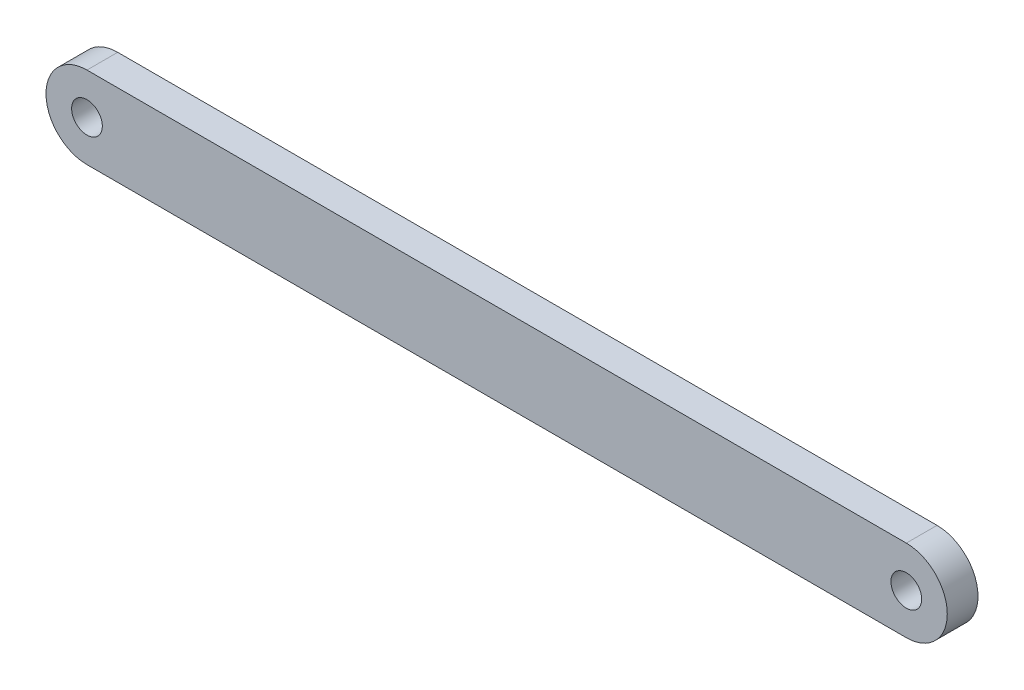
ISO-10303-21;
HEADER;
FILE_DESCRIPTION(('STEP AP214'),'2;1');
FILE_NAME('part.step','',(''),(''),'','','');
FILE_SCHEMA(('AUTOMOTIVE_DESIGN { 1 0 10303 214 1 1 1 1 }'));
ENDSEC;
DATA;
#1=APPLICATION_CONTEXT('core data for automotive mechanical design processes');
#2=APPLICATION_PROTOCOL_DEFINITION('international standard','automotive_design',2000,#1);
#3=PRODUCT_CONTEXT('',#1,'mechanical');
#4=PRODUCT('Part','Part','',(#3));
#5=PRODUCT_RELATED_PRODUCT_CATEGORY('part','',(#4));
#6=PRODUCT_DEFINITION_FORMATION('','',#4);
#7=PRODUCT_DEFINITION_CONTEXT('part definition',#1,'design');
#8=PRODUCT_DEFINITION('design','',#6,#7);
#9=PRODUCT_DEFINITION_SHAPE('','',#8);
#10=(LENGTH_UNIT() NAMED_UNIT(*) SI_UNIT(.MILLI.,.METRE.));
#11=(NAMED_UNIT(*) PLANE_ANGLE_UNIT() SI_UNIT($,.RADIAN.));
#12=(NAMED_UNIT(*) SI_UNIT($,.STERADIAN.) SOLID_ANGLE_UNIT());
#13=UNCERTAINTY_MEASURE_WITH_UNIT(LENGTH_MEASURE(1.E-05),#10,'distance_accuracy_value','');
#14=(GEOMETRIC_REPRESENTATION_CONTEXT(3) GLOBAL_UNCERTAINTY_ASSIGNED_CONTEXT((#13)) GLOBAL_UNIT_ASSIGNED_CONTEXT((#10,
#11,#12)) REPRESENTATION_CONTEXT('',''));
#15=CARTESIAN_POINT('',(0.,0.,0.));
#16=DIRECTION('',(0.,0.,1.));
#17=DIRECTION('',(1.,0.,0.));
#18=AXIS2_PLACEMENT_3D('',#15,#16,#17);
#19=CARTESIAN_POINT('',(-65.045038185394,-11.5842044872883,3.));
#20=DIRECTION('',(0.,0.,1.));
#21=DIRECTION('',(1.,0.,0.));
#22=AXIS2_PLACEMENT_3D('',#19,#20,#21);
#23=PLANE('',#22);
#24=CARTESIAN_POINT('',(-65.045038185394,-11.5842044872883,3.));
#25=DIRECTION('',(0.,0.,1.));
#26=DIRECTION('',(1.,0.,0.));
#27=AXIS2_PLACEMENT_3D('',#24,#25,#26);
#28=CIRCLE('',#27,1.5);
#29=CARTESIAN_POINT('',(-63.545038185394,-11.5842044872883,3.));
#30=VERTEX_POINT('',#29);
#31=EDGE_CURVE('E101',#30,#30,#28,.T.);
#32=ORIENTED_EDGE('',*,*,#31,.F.);
#33=EDGE_LOOP('',(#32));
#34=FACE_BOUND('',#33,.T.);
#35=CARTESIAN_POINT('',(-65.045038185394,-11.5842044872883,3.));
#36=DIRECTION('',(0.,0.,1.));
#37=DIRECTION('',(1.,0.,0.));
#38=AXIS2_PLACEMENT_3D('',#35,#36,#37);
#39=CIRCLE('',#38,4.);
#40=CARTESIAN_POINT('',(-65.045038185394,-7.58420448728826,3.));
#41=VERTEX_POINT('',#40);
#42=CARTESIAN_POINT('',(-65.045038185394,-15.5842044872883,3.));
#43=VERTEX_POINT('',#42);
#44=EDGE_CURVE('E86',#41,#43,#39,.T.);
#45=ORIENTED_EDGE('',*,*,#44,.T.);
#46=DIRECTION('',(1.,0.,0.));
#47=VECTOR('',#46,1.);
#48=CARTESIAN_POINT('',(-65.045038185394,-15.5842044872883,3.));
#49=LINE('',#48,#47);
#50=CARTESIAN_POINT('',(14.954961814606,-15.5842044872883,3.));
#51=VERTEX_POINT('',#50);
#52=EDGE_CURVE('E81',#43,#51,#49,.T.);
#53=ORIENTED_EDGE('',*,*,#52,.T.);
#54=CARTESIAN_POINT('',(14.954961814606,-11.5842044872883,3.));
#55=DIRECTION('',(0.,0.,1.));
#56=DIRECTION('',(1.,0.,0.));
#57=AXIS2_PLACEMENT_3D('',#54,#55,#56);
#58=CIRCLE('',#57,4.);
#59=CARTESIAN_POINT('',(14.954961814606,-7.58420448728826,3.));
#60=VERTEX_POINT('',#59);
#61=EDGE_CURVE('E84',#51,#60,#58,.T.);
#62=ORIENTED_EDGE('',*,*,#61,.T.);
#63=DIRECTION('',(-1.,0.,0.));
#64=VECTOR('',#63,1.);
#65=CARTESIAN_POINT('',(-65.045038185394,-7.58420448728826,3.));
#66=LINE('',#65,#64);
#67=EDGE_CURVE('E51',#60,#41,#66,.T.);
#68=ORIENTED_EDGE('',*,*,#67,.T.);
#69=EDGE_LOOP('',(#45,#53,#62,#68));
#70=FACE_BOUND('',#69,.T.);
#71=CARTESIAN_POINT('',(14.954961814606,-11.5842044872883,3.));
#72=DIRECTION('',(0.,0.,1.));
#73=DIRECTION('',(1.,0.,0.));
#74=AXIS2_PLACEMENT_3D('',#71,#72,#73);
#75=CIRCLE('',#74,1.5);
#76=CARTESIAN_POINT('',(16.454961814606,-11.5842044872883,3.));
#77=VERTEX_POINT('',#76);
#78=EDGE_CURVE('E116',#77,#77,#75,.T.);
#79=ORIENTED_EDGE('',*,*,#78,.F.);
#80=EDGE_LOOP('',(#79));
#81=FACE_BOUND('',#80,.T.);
#82=ADVANCED_FACE('F34',(#34,#70,#81),#23,.T.);
#83=CARTESIAN_POINT('',(-65.045038185394,-11.5842044872883,0.));
#84=DIRECTION('',(0.,0.,1.));
#85=DIRECTION('',(1.,0.,0.));
#86=AXIS2_PLACEMENT_3D('',#83,#84,#85);
#87=PLANE('',#86);
#88=CARTESIAN_POINT('',(-65.045038185394,-11.5842044872883,0.));
#89=DIRECTION('',(0.,0.,1.));
#90=DIRECTION('',(1.,0.,0.));
#91=AXIS2_PLACEMENT_3D('',#88,#89,#90);
#92=CIRCLE('',#91,1.5);
#93=CARTESIAN_POINT('',(-63.545038185394,-11.5842044872883,0.));
#94=VERTEX_POINT('',#93);
#95=EDGE_CURVE('E113',#94,#94,#92,.T.);
#96=ORIENTED_EDGE('',*,*,#95,.T.);
#97=EDGE_LOOP('',(#96));
#98=FACE_BOUND('',#97,.T.);
#99=CARTESIAN_POINT('',(-65.045038185394,-11.5842044872883,0.));
#100=DIRECTION('',(0.,0.,1.));
#101=DIRECTION('',(1.,0.,0.));
#102=AXIS2_PLACEMENT_3D('',#99,#100,#101);
#103=CIRCLE('',#102,4.);
#104=CARTESIAN_POINT('',(-65.045038185394,-7.58420448728826,0.));
#105=VERTEX_POINT('',#104);
#106=CARTESIAN_POINT('',(-65.045038185394,-15.5842044872883,0.));
#107=VERTEX_POINT('',#106);
#108=EDGE_CURVE('E98',#105,#107,#103,.T.);
#109=ORIENTED_EDGE('',*,*,#108,.F.);
#110=DIRECTION('',(-1.,0.,0.));
#111=VECTOR('',#110,1.);
#112=CARTESIAN_POINT('',(-65.045038185394,-7.58420448728826,0.));
#113=LINE('',#112,#111);
#114=CARTESIAN_POINT('',(14.954961814606,-7.58420448728826,0.));
#115=VERTEX_POINT('',#114);
#116=EDGE_CURVE('E74',#115,#105,#113,.T.);
#117=ORIENTED_EDGE('',*,*,#116,.F.);
#118=CARTESIAN_POINT('',(14.954961814606,-11.5842044872883,0.));
#119=DIRECTION('',(0.,0.,1.));
#120=DIRECTION('',(1.,0.,0.));
#121=AXIS2_PLACEMENT_3D('',#118,#119,#120);
#122=CIRCLE('',#121,4.);
#123=CARTESIAN_POINT('',(14.954961814606,-15.5842044872883,0.));
#124=VERTEX_POINT('',#123);
#125=EDGE_CURVE('E68',#124,#115,#122,.T.);
#126=ORIENTED_EDGE('',*,*,#125,.F.);
#127=DIRECTION('',(1.,0.,0.));
#128=VECTOR('',#127,1.);
#129=CARTESIAN_POINT('',(-65.045038185394,-15.5842044872883,0.));
#130=LINE('',#129,#128);
#131=EDGE_CURVE('E90',#107,#124,#130,.T.);
#132=ORIENTED_EDGE('',*,*,#131,.F.);
#133=EDGE_LOOP('',(#109,#117,#126,#132));
#134=FACE_BOUND('',#133,.T.);
#135=CARTESIAN_POINT('',(14.954961814606,-11.5842044872883,0.));
#136=DIRECTION('',(0.,0.,1.));
#137=DIRECTION('',(1.,0.,0.));
#138=AXIS2_PLACEMENT_3D('',#135,#136,#137);
#139=CIRCLE('',#138,1.5);
#140=CARTESIAN_POINT('',(16.454961814606,-11.5842044872883,0.));
#141=VERTEX_POINT('',#140);
#142=EDGE_CURVE('E119',#141,#141,#139,.T.);
#143=ORIENTED_EDGE('',*,*,#142,.T.);
#144=EDGE_LOOP('',(#143));
#145=FACE_BOUND('',#144,.T.);
#146=ADVANCED_FACE('F109',(#98,#134,#145),#87,.F.);
#147=CARTESIAN_POINT('',(-65.045038185394,-11.5842044872883,3.));
#148=DIRECTION('',(0.,0.,-1.));
#149=DIRECTION('',(-1.,0.,0.));
#150=AXIS2_PLACEMENT_3D('',#147,#148,#149);
#151=CYLINDRICAL_SURFACE('',#150,4.);
#152=ORIENTED_EDGE('',*,*,#108,.T.);
#153=DIRECTION('',(0.,0.,-1.));
#154=VECTOR('',#153,1.);
#155=CARTESIAN_POINT('',(-65.045038185394,-15.5842044872883,3.));
#156=LINE('',#155,#154);
#157=EDGE_CURVE('E11',#43,#107,#156,.T.);
#158=ORIENTED_EDGE('',*,*,#157,.F.);
#159=ORIENTED_EDGE('',*,*,#44,.F.);
#160=DIRECTION('',(0.,0.,-1.));
#161=VECTOR('',#160,1.);
#162=CARTESIAN_POINT('',(-65.045038185394,-7.58420448728826,3.));
#163=LINE('',#162,#161);
#164=EDGE_CURVE('E94',#41,#105,#163,.T.);
#165=ORIENTED_EDGE('',*,*,#164,.T.);
#166=EDGE_LOOP('',(#152,#158,#159,#165));
#167=FACE_BOUND('',#166,.T.);
#168=ADVANCED_FACE('F36',(#167),#151,.T.);
#169=CARTESIAN_POINT('',(-65.045038185394,-15.5842044872883,3.));
#170=DIRECTION('',(0.,1.,0.));
#171=DIRECTION('',(0.,0.,1.));
#172=AXIS2_PLACEMENT_3D('',#169,#170,#171);
#173=PLANE('',#172);
#174=ORIENTED_EDGE('',*,*,#131,.T.);
#175=DIRECTION('',(0.,0.,-1.));
#176=VECTOR('',#175,1.);
#177=CARTESIAN_POINT('',(14.954961814606,-15.5842044872883,3.));
#178=LINE('',#177,#176);
#179=EDGE_CURVE('E43',#51,#124,#178,.T.);
#180=ORIENTED_EDGE('',*,*,#179,.F.);
#181=ORIENTED_EDGE('',*,*,#52,.F.);
#182=ORIENTED_EDGE('',*,*,#157,.T.);
#183=EDGE_LOOP('',(#174,#180,#181,#182));
#184=FACE_BOUND('',#183,.T.);
#185=ADVANCED_FACE('F89',(#184),#173,.F.);
#186=CARTESIAN_POINT('',(14.954961814606,-11.5842044872883,3.));
#187=DIRECTION('',(0.,0.,-1.));
#188=DIRECTION('',(-1.,0.,0.));
#189=AXIS2_PLACEMENT_3D('',#186,#187,#188);
#190=CYLINDRICAL_SURFACE('',#189,4.);
#191=ORIENTED_EDGE('',*,*,#125,.T.);
#192=DIRECTION('',(0.,0.,-1.));
#193=VECTOR('',#192,1.);
#194=CARTESIAN_POINT('',(14.954961814606,-7.58420448728826,3.));
#195=LINE('',#194,#193);
#196=EDGE_CURVE('E91',#60,#115,#195,.T.);
#197=ORIENTED_EDGE('',*,*,#196,.F.);
#198=ORIENTED_EDGE('',*,*,#61,.F.);
#199=ORIENTED_EDGE('',*,*,#179,.T.);
#200=EDGE_LOOP('',(#191,#197,#198,#199));
#201=FACE_BOUND('',#200,.T.);
#202=ADVANCED_FACE('F92',(#201),#190,.T.);
#203=CARTESIAN_POINT('',(-65.045038185394,-7.58420448728826,3.));
#204=DIRECTION('',(0.,-1.,0.));
#205=DIRECTION('',(0.,0.,-1.));
#206=AXIS2_PLACEMENT_3D('',#203,#204,#205);
#207=PLANE('',#206);
#208=ORIENTED_EDGE('',*,*,#116,.T.);
#209=ORIENTED_EDGE('',*,*,#164,.F.);
#210=ORIENTED_EDGE('',*,*,#67,.F.);
#211=ORIENTED_EDGE('',*,*,#196,.T.);
#212=EDGE_LOOP('',(#208,#209,#210,#211));
#213=FACE_BOUND('',#212,.T.);
#214=ADVANCED_FACE('F106',(#213),#207,.F.);
#215=CARTESIAN_POINT('',(-65.045038185394,-11.5842044872883,3.));
#216=DIRECTION('',(0.,0.,-1.));
#217=DIRECTION('',(-1.,0.,0.));
#218=AXIS2_PLACEMENT_3D('',#215,#216,#217);
#219=CYLINDRICAL_SURFACE('',#218,1.5);
#220=ORIENTED_EDGE('',*,*,#31,.T.);
#221=EDGE_LOOP('',(#220));
#222=FACE_BOUND('',#221,.T.);
#223=ORIENTED_EDGE('',*,*,#95,.F.);
#224=EDGE_LOOP('',(#223));
#225=FACE_BOUND('',#224,.T.);
#226=ADVANCED_FACE('F137',(#222,#225),#219,.F.);
#227=CARTESIAN_POINT('',(14.954961814606,-11.5842044872883,3.));
#228=DIRECTION('',(0.,0.,-1.));
#229=DIRECTION('',(-1.,0.,0.));
#230=AXIS2_PLACEMENT_3D('',#227,#228,#229);
#231=CYLINDRICAL_SURFACE('',#230,1.5);
#232=ORIENTED_EDGE('',*,*,#78,.T.);
#233=EDGE_LOOP('',(#232));
#234=FACE_BOUND('',#233,.T.);
#235=ORIENTED_EDGE('',*,*,#142,.F.);
#236=EDGE_LOOP('',(#235));
#237=FACE_BOUND('',#236,.T.);
#238=ADVANCED_FACE('F125',(#234,#237),#231,.F.);
#239=CLOSED_SHELL('',(#82,#146,#168,#185,#202,#214,#226,#238));
#240=MANIFOLD_SOLID_BREP('B2',#239);
#241=ADVANCED_BREP_SHAPE_REPRESENTATION('',(#18,#240),#14);
#242=SHAPE_DEFINITION_REPRESENTATION(#9,#241);
ENDSEC;
END-ISO-10303-21;
